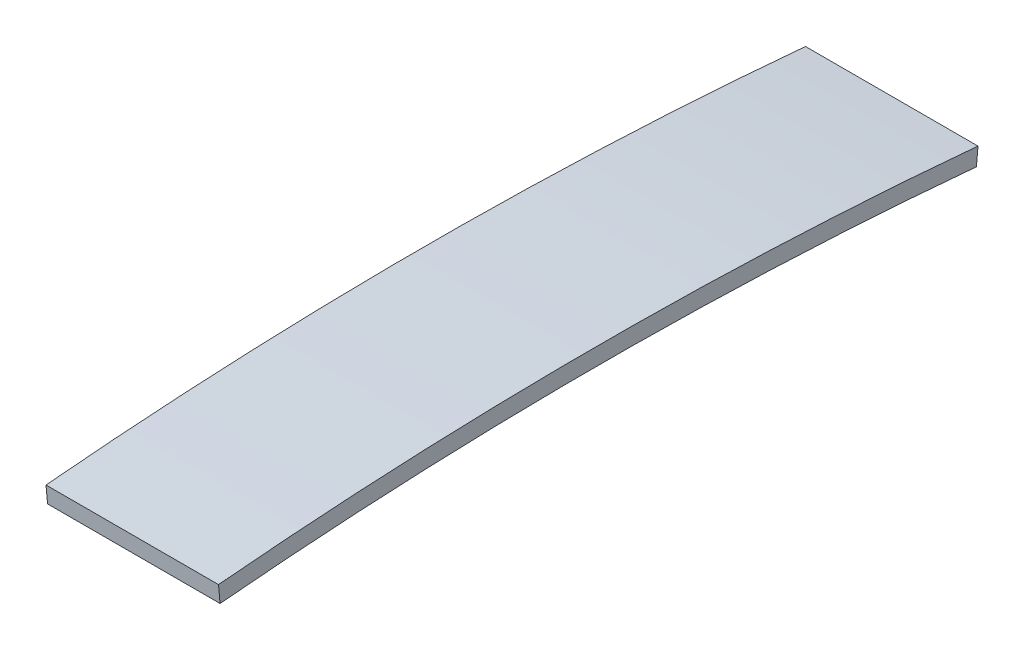
ISO-10303-21;
HEADER;
FILE_DESCRIPTION(('STEP AP214'),'2;1');
FILE_NAME('part.step','',(''),(''),'','','');
FILE_SCHEMA(('AUTOMOTIVE_DESIGN { 1 0 10303 214 1 1 1 1 }'));
ENDSEC;
DATA;
#1=APPLICATION_CONTEXT('core data for automotive mechanical design processes');
#2=APPLICATION_PROTOCOL_DEFINITION('international standard','automotive_design',2000,#1);
#3=PRODUCT_CONTEXT('',#1,'mechanical');
#4=PRODUCT('Part','Part','',(#3));
#5=PRODUCT_RELATED_PRODUCT_CATEGORY('part','',(#4));
#6=PRODUCT_DEFINITION_FORMATION('','',#4);
#7=PRODUCT_DEFINITION_CONTEXT('part definition',#1,'design');
#8=PRODUCT_DEFINITION('design','',#6,#7);
#9=PRODUCT_DEFINITION_SHAPE('','',#8);
#10=(LENGTH_UNIT() NAMED_UNIT(*) SI_UNIT(.MILLI.,.METRE.));
#11=(NAMED_UNIT(*) PLANE_ANGLE_UNIT() SI_UNIT($,.RADIAN.));
#12=(NAMED_UNIT(*) SI_UNIT($,.STERADIAN.) SOLID_ANGLE_UNIT());
#13=UNCERTAINTY_MEASURE_WITH_UNIT(LENGTH_MEASURE(1.E-05),#10,'distance_accuracy_value','');
#14=(GEOMETRIC_REPRESENTATION_CONTEXT(3) GLOBAL_UNCERTAINTY_ASSIGNED_CONTEXT((#13)) GLOBAL_UNIT_ASSIGNED_CONTEXT((#10,
#11,#12)) REPRESENTATION_CONTEXT('',''));
#15=CARTESIAN_POINT('',(0.,0.,0.));
#16=DIRECTION('',(0.,0.,1.));
#17=DIRECTION('',(1.,0.,0.));
#18=AXIS2_PLACEMENT_3D('',#15,#16,#17);
#19=CARTESIAN_POINT('',(5.,0.,0.));
#20=DIRECTION('',(-1.,0.,0.));
#21=DIRECTION('',(0.,0.,1.));
#22=AXIS2_PLACEMENT_3D('',#19,#20,#21);
#23=CYLINDRICAL_SURFACE('',#22,120.9161570025);
#24=DIRECTION('',(1.,0.,0.));
#25=VECTOR('',#24,1.);
#26=CARTESIAN_POINT('',(5.,120.418216036538,-10.9622201597557));
#27=LINE('',#26,#25);
#28=CARTESIAN_POINT('',(5.,120.418216036538,-10.9622201597557));
#29=VERTEX_POINT('',#28);
#30=CARTESIAN_POINT('',(0.,120.418216036538,-10.9622201597557));
#31=VERTEX_POINT('',#30);
#32=EDGE_CURVE('E80',#29,#31,#27,.F.);
#33=ORIENTED_EDGE('',*,*,#32,.F.);
#34=CARTESIAN_POINT('',(5.,0.,0.));
#35=DIRECTION('',(-1.,0.,0.));
#36=DIRECTION('',(0.,0.,1.));
#37=AXIS2_PLACEMENT_3D('',#34,#35,#36);
#38=CIRCLE('',#37,120.9161570025);
#39=CARTESIAN_POINT('',(5.,120.418216036538,10.9622201597557));
#40=VERTEX_POINT('',#39);
#41=EDGE_CURVE('E67',#40,#29,#38,.T.);
#42=ORIENTED_EDGE('',*,*,#41,.F.);
#43=DIRECTION('',(1.,0.,0.));
#44=VECTOR('',#43,1.);
#45=CARTESIAN_POINT('',(5.,120.418216036538,10.9622201597557));
#46=LINE('',#45,#44);
#47=CARTESIAN_POINT('',(0.,120.418216036538,10.9622201597557));
#48=VERTEX_POINT('',#47);
#49=EDGE_CURVE('E66',#48,#40,#46,.T.);
#50=ORIENTED_EDGE('',*,*,#49,.F.);
#51=CARTESIAN_POINT('',(0.,0.,0.));
#52=DIRECTION('',(-1.,0.,0.));
#53=DIRECTION('',(0.,0.,1.));
#54=AXIS2_PLACEMENT_3D('',#51,#52,#53);
#55=CIRCLE('',#54,120.9161570025);
#56=EDGE_CURVE('E20',#48,#31,#55,.T.);
#57=ORIENTED_EDGE('',*,*,#56,.T.);
#58=EDGE_LOOP('',(#33,#42,#50,#57));
#59=FACE_BOUND('',#58,.T.);
#60=ADVANCED_FACE('F17',(#59),#23,.F.);
#61=CARTESIAN_POINT('',(0.,0.,0.));
#62=DIRECTION('',(1.,0.,0.));
#63=DIRECTION('',(0.,0.,-1.));
#64=AXIS2_PLACEMENT_3D('',#61,#62,#63);
#65=PLANE('',#64);
#66=DIRECTION('',(0.,-0.995881931924518,-0.0906596804885754));
#67=VECTOR('',#66,1.);
#68=CARTESIAN_POINT('',(0.,120.418216036538,10.9622201597557));
#69=LINE('',#68,#67);
#70=CARTESIAN_POINT('',(0.,120.9161570025,11.00755));
#71=VERTEX_POINT('',#70);
#72=EDGE_CURVE('E58',#71,#48,#69,.T.);
#73=ORIENTED_EDGE('',*,*,#72,.F.);
#74=CARTESIAN_POINT('',(0.,0.,0.));
#75=DIRECTION('',(-1.,0.,0.));
#76=DIRECTION('',(0.,0.,1.));
#77=AXIS2_PLACEMENT_3D('',#74,#75,#76);
#78=CIRCLE('',#77,121.4161570025);
#79=CARTESIAN_POINT('',(0.,120.9161570025,-11.00755));
#80=VERTEX_POINT('',#79);
#81=EDGE_CURVE('E81',#80,#71,#78,.F.);
#82=ORIENTED_EDGE('',*,*,#81,.F.);
#83=DIRECTION('',(0.,0.995881931924514,-0.0906596804886202));
#84=VECTOR('',#83,1.);
#85=CARTESIAN_POINT('',(0.,120.9161570025,-11.00755));
#86=LINE('',#85,#84);
#87=EDGE_CURVE('E61',#31,#80,#86,.T.);
#88=ORIENTED_EDGE('',*,*,#87,.F.);
#89=ORIENTED_EDGE('',*,*,#56,.F.);
#90=EDGE_LOOP('',(#73,#82,#88,#89));
#91=FACE_BOUND('',#90,.T.);
#92=ADVANCED_FACE('F56',(#91),#65,.F.);
#93=CARTESIAN_POINT('',(5.,120.418216036538,10.9622201597557));
#94=DIRECTION('',(0.,-0.0906596804885754,0.995881931924518));
#95=DIRECTION('',(0.,-0.995881931924518,-0.0906596804885754));
#96=AXIS2_PLACEMENT_3D('',#93,#94,#95);
#97=PLANE('',#96);
#98=DIRECTION('',(0.,-0.995881931924518,-0.090659680488572));
#99=VECTOR('',#98,1.);
#100=CARTESIAN_POINT('',(5.,120.9161570025,11.00755));
#101=LINE('',#100,#99);
#102=CARTESIAN_POINT('',(5.,120.9161570025,11.00755));
#103=VERTEX_POINT('',#102);
#104=EDGE_CURVE('E79',#103,#40,#101,.T.);
#105=ORIENTED_EDGE('',*,*,#104,.F.);
#106=DIRECTION('',(-1.,0.,0.));
#107=VECTOR('',#106,1.);
#108=CARTESIAN_POINT('',(5.,120.9161570025,11.00755));
#109=LINE('',#108,#107);
#110=EDGE_CURVE('E73',#71,#103,#109,.F.);
#111=ORIENTED_EDGE('',*,*,#110,.F.);
#112=ORIENTED_EDGE('',*,*,#72,.T.);
#113=ORIENTED_EDGE('',*,*,#49,.T.);
#114=EDGE_LOOP('',(#105,#111,#112,#113));
#115=FACE_BOUND('',#114,.T.);
#116=ADVANCED_FACE('F71',(#115),#97,.T.);
#117=CARTESIAN_POINT('',(5.,0.,0.));
#118=DIRECTION('',(1.,0.,0.));
#119=DIRECTION('',(0.,0.,-1.));
#120=AXIS2_PLACEMENT_3D('',#117,#118,#119);
#121=PLANE('',#120);
#122=CARTESIAN_POINT('',(5.,0.,0.));
#123=DIRECTION('',(-1.,0.,0.));
#124=DIRECTION('',(0.,0.,1.));
#125=AXIS2_PLACEMENT_3D('',#122,#123,#124);
#126=CIRCLE('',#125,121.4161570025);
#127=CARTESIAN_POINT('',(5.,120.9161570025,-11.00755));
#128=VERTEX_POINT('',#127);
#129=EDGE_CURVE('E26',#103,#128,#126,.T.);
#130=ORIENTED_EDGE('',*,*,#129,.F.);
#131=ORIENTED_EDGE('',*,*,#104,.T.);
#132=ORIENTED_EDGE('',*,*,#41,.T.);
#133=DIRECTION('',(0.,0.995881931924514,-0.0906596804886202));
#134=VECTOR('',#133,1.);
#135=CARTESIAN_POINT('',(5.,120.9161570025,-11.00755));
#136=LINE('',#135,#134);
#137=EDGE_CURVE('E35',#128,#29,#136,.F.);
#138=ORIENTED_EDGE('',*,*,#137,.F.);
#139=EDGE_LOOP('',(#130,#131,#132,#138));
#140=FACE_BOUND('',#139,.T.);
#141=ADVANCED_FACE('F92',(#140),#121,.T.);
#142=CARTESIAN_POINT('',(5.,120.9161570025,-11.00755));
#143=DIRECTION('',(0.,-0.0906596804886202,-0.995881931924514));
#144=DIRECTION('',(0.,0.995881931924514,-0.0906596804886202));
#145=AXIS2_PLACEMENT_3D('',#142,#143,#144);
#146=PLANE('',#145);
#147=ORIENTED_EDGE('',*,*,#137,.T.);
#148=ORIENTED_EDGE('',*,*,#32,.T.);
#149=ORIENTED_EDGE('',*,*,#87,.T.);
#150=DIRECTION('',(-1.,0.,0.));
#151=VECTOR('',#150,1.);
#152=CARTESIAN_POINT('',(5.,120.9161570025,-11.00755));
#153=LINE('',#152,#151);
#154=EDGE_CURVE('E11',#128,#80,#153,.T.);
#155=ORIENTED_EDGE('',*,*,#154,.F.);
#156=EDGE_LOOP('',(#147,#148,#149,#155));
#157=FACE_BOUND('',#156,.T.);
#158=ADVANCED_FACE('F90',(#157),#146,.T.);
#159=CARTESIAN_POINT('',(5.,0.,0.));
#160=DIRECTION('',(-1.,0.,0.));
#161=DIRECTION('',(0.,0.,1.));
#162=AXIS2_PLACEMENT_3D('',#159,#160,#161);
#163=CYLINDRICAL_SURFACE('',#162,121.4161570025);
#164=ORIENTED_EDGE('',*,*,#129,.T.);
#165=ORIENTED_EDGE('',*,*,#154,.T.);
#166=ORIENTED_EDGE('',*,*,#81,.T.);
#167=ORIENTED_EDGE('',*,*,#110,.T.);
#168=EDGE_LOOP('',(#164,#165,#166,#167));
#169=FACE_BOUND('',#168,.T.);
#170=ADVANCED_FACE('F88',(#169),#163,.T.);
#171=CLOSED_SHELL('',(#60,#92,#116,#141,#158,#170));
#172=MANIFOLD_SOLID_BREP('B1',#171);
#173=ADVANCED_BREP_SHAPE_REPRESENTATION('',(#18,#172),#14);
#174=SHAPE_DEFINITION_REPRESENTATION(#9,#173);
ENDSEC;
END-ISO-10303-21;
